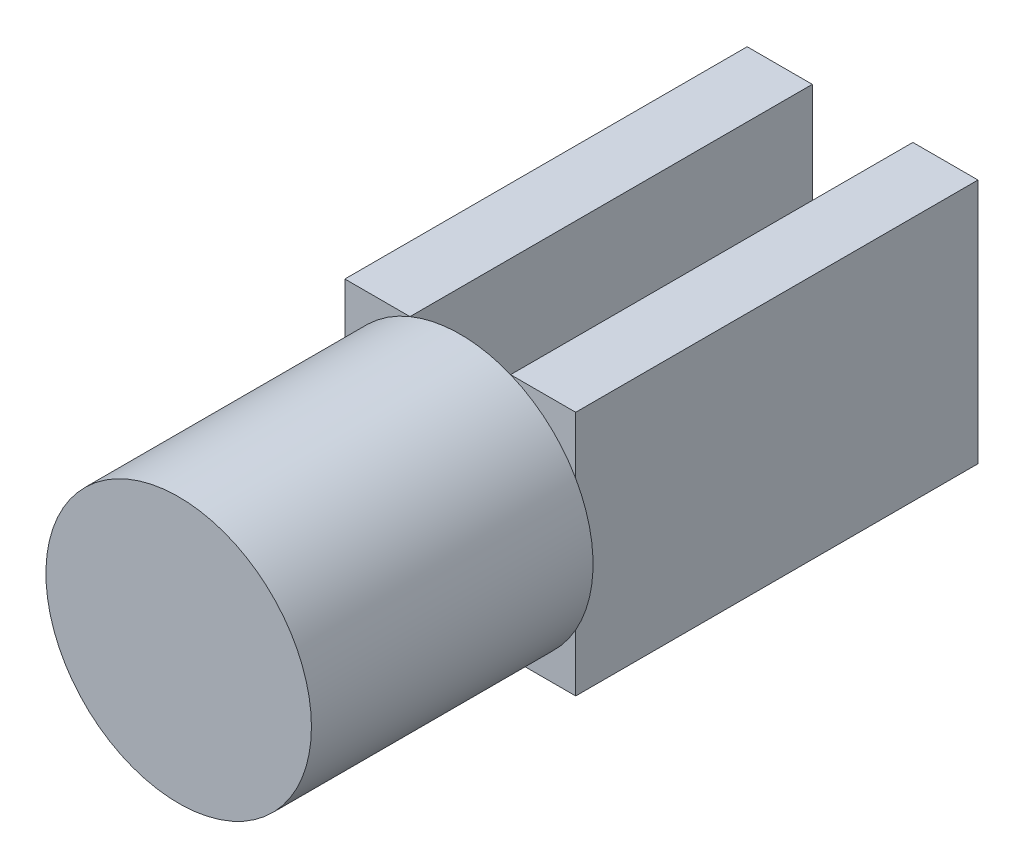
ISO-10303-21;
HEADER;
FILE_DESCRIPTION(('STEP AP214'),'2;1');
FILE_NAME('part.step','',(''),(''),'','','');
FILE_SCHEMA(('AUTOMOTIVE_DESIGN { 1 0 10303 214 1 1 1 1 }'));
ENDSEC;
DATA;
#1=APPLICATION_CONTEXT('core data for automotive mechanical design processes');
#2=APPLICATION_PROTOCOL_DEFINITION('international standard','automotive_design',2000,#1);
#3=PRODUCT_CONTEXT('',#1,'mechanical');
#4=PRODUCT('Part','Part','',(#3));
#5=PRODUCT_RELATED_PRODUCT_CATEGORY('part','',(#4));
#6=PRODUCT_DEFINITION_FORMATION('','',#4);
#7=PRODUCT_DEFINITION_CONTEXT('part definition',#1,'design');
#8=PRODUCT_DEFINITION('design','',#6,#7);
#9=PRODUCT_DEFINITION_SHAPE('','',#8);
#10=(LENGTH_UNIT() NAMED_UNIT(*) SI_UNIT(.MILLI.,.METRE.));
#11=(NAMED_UNIT(*) PLANE_ANGLE_UNIT() SI_UNIT($,.RADIAN.));
#12=(NAMED_UNIT(*) SI_UNIT($,.STERADIAN.) SOLID_ANGLE_UNIT());
#13=UNCERTAINTY_MEASURE_WITH_UNIT(LENGTH_MEASURE(1.E-05),#10,'distance_accuracy_value','');
#14=(GEOMETRIC_REPRESENTATION_CONTEXT(3) GLOBAL_UNCERTAINTY_ASSIGNED_CONTEXT((#13)) GLOBAL_UNIT_ASSIGNED_CONTEXT((#10,
#11,#12)) REPRESENTATION_CONTEXT('',''));
#15=CARTESIAN_POINT('',(0.,0.,0.));
#16=DIRECTION('',(0.,0.,1.));
#17=DIRECTION('',(1.,0.,0.));
#18=AXIS2_PLACEMENT_3D('',#15,#16,#17);
#19=CARTESIAN_POINT('',(0.,0.,0.));
#20=DIRECTION('',(0.,0.,1.));
#21=DIRECTION('',(1.,0.,0.));
#22=AXIS2_PLACEMENT_3D('',#19,#20,#21);
#23=PLANE('',#22);
#24=DIRECTION('',(0.,-1.,0.));
#25=VECTOR('',#24,1.);
#26=CARTESIAN_POINT('',(-12.5,30.5409561081509,0.));
#27=LINE('',#26,#25);
#28=CARTESIAN_POINT('',(-12.5,30.5409561081509,0.));
#29=VERTEX_POINT('',#28);
#30=CARTESIAN_POINT('',(-12.5,-30.5409561081509,0.));
#31=VERTEX_POINT('',#30);
#32=EDGE_CURVE('E134',#29,#31,#27,.T.);
#33=ORIENTED_EDGE('',*,*,#32,.F.);
#34=CARTESIAN_POINT('',(0.,0.,0.));
#35=DIRECTION('',(0.,0.,1.));
#36=DIRECTION('',(1.,0.,0.));
#37=AXIS2_PLACEMENT_3D('',#34,#35,#36);
#38=CIRCLE('',#37,33.);
#39=CARTESIAN_POINT('',(12.5,30.5409561081509,0.));
#40=VERTEX_POINT('',#39);
#41=EDGE_CURVE('E124',#40,#29,#38,.T.);
#42=ORIENTED_EDGE('',*,*,#41,.F.);
#43=DIRECTION('',(0.,-1.,0.));
#44=VECTOR('',#43,1.);
#45=CARTESIAN_POINT('',(12.5,30.5409561081509,0.));
#46=LINE('',#45,#44);
#47=CARTESIAN_POINT('',(12.5,-30.5409561081509,0.));
#48=VERTEX_POINT('',#47);
#49=EDGE_CURVE('E147',#40,#48,#46,.T.);
#50=ORIENTED_EDGE('',*,*,#49,.T.);
#51=EDGE_CURVE('E58',#31,#48,#38,.T.);
#52=ORIENTED_EDGE('',*,*,#51,.F.);
#53=EDGE_LOOP('',(#33,#42,#50,#52));
#54=FACE_BOUND('',#53,.T.);
#55=ADVANCED_FACE('F35',(#54),#23,.F.);
#56=DIRECTION('',(0.,-1.,0.));
#57=VECTOR('',#56,1.);
#58=CARTESIAN_POINT('',(28.6905653042879,30.5409561081509,0.));
#59=LINE('',#58,#57);
#60=CARTESIAN_POINT('',(28.6905653042879,16.3049520858048,0.));
#61=VERTEX_POINT('',#60);
#62=CARTESIAN_POINT('',(28.6905653042879,-16.3049520858048,0.));
#63=VERTEX_POINT('',#62);
#64=EDGE_CURVE('E43',#61,#63,#59,.T.);
#65=ORIENTED_EDGE('',*,*,#64,.F.);
#66=EDGE_CURVE('E126',#63,#61,#38,.T.);
#67=ORIENTED_EDGE('',*,*,#66,.F.);
#68=EDGE_LOOP('',(#65,#67));
#69=FACE_BOUND('',#68,.T.);
#70=ADVANCED_FACE('F240',(#69),#23,.F.);
#71=CARTESIAN_POINT('',(0.,0.,70.));
#72=DIRECTION('',(0.,0.,-1.));
#73=DIRECTION('',(-1.,0.,0.));
#74=AXIS2_PLACEMENT_3D('',#71,#72,#73);
#75=CYLINDRICAL_SURFACE('',#74,33.);
#76=CARTESIAN_POINT('',(0.,0.,70.));
#77=DIRECTION('',(0.,0.,1.));
#78=DIRECTION('',(1.,0.,0.));
#79=AXIS2_PLACEMENT_3D('',#76,#77,#78);
#80=CIRCLE('',#79,33.);
#81=CARTESIAN_POINT('',(33.,0.,70.));
#82=VERTEX_POINT('',#81);
#83=EDGE_CURVE('E155',#82,#82,#80,.T.);
#84=ORIENTED_EDGE('',*,*,#83,.F.);
#85=EDGE_LOOP('',(#84));
#86=FACE_BOUND('',#85,.T.);
#87=EDGE_CURVE('E152',#61,#40,#38,.T.);
#88=ORIENTED_EDGE('',*,*,#87,.T.);
#89=ORIENTED_EDGE('',*,*,#41,.T.);
#90=CARTESIAN_POINT('',(-28.6905653042879,16.3049520858048,0.));
#91=VERTEX_POINT('',#90);
#92=EDGE_CURVE('E114',#29,#91,#38,.T.);
#93=ORIENTED_EDGE('',*,*,#92,.T.);
#94=CARTESIAN_POINT('',(-28.6905653042879,-16.3049520858048,0.));
#95=VERTEX_POINT('',#94);
#96=EDGE_CURVE('E125',#91,#95,#38,.T.);
#97=ORIENTED_EDGE('',*,*,#96,.T.);
#98=EDGE_CURVE('E159',#95,#31,#38,.T.);
#99=ORIENTED_EDGE('',*,*,#98,.T.);
#100=ORIENTED_EDGE('',*,*,#51,.T.);
#101=EDGE_CURVE('E154',#48,#63,#38,.T.);
#102=ORIENTED_EDGE('',*,*,#101,.T.);
#103=ORIENTED_EDGE('',*,*,#66,.T.);
#104=EDGE_LOOP('',(#88,#89,#93,#97,#99,#100,#102,#103));
#105=FACE_BOUND('',#104,.T.);
#106=ADVANCED_FACE('F37',(#86,#105),#75,.T.);
#107=CARTESIAN_POINT('',(0.,0.,70.));
#108=DIRECTION('',(0.,0.,1.));
#109=DIRECTION('',(1.,0.,0.));
#110=AXIS2_PLACEMENT_3D('',#107,#108,#109);
#111=PLANE('',#110);
#112=ORIENTED_EDGE('',*,*,#83,.T.);
#113=EDGE_LOOP('',(#112));
#114=FACE_BOUND('',#113,.T.);
#115=ADVANCED_FACE('F248',(#114),#111,.T.);
#116=ORIENTED_EDGE('',*,*,#96,.F.);
#117=DIRECTION('',(0.,-1.,0.));
#118=VECTOR('',#117,1.);
#119=CARTESIAN_POINT('',(-28.6905653042879,0.,0.));
#120=LINE('',#119,#118);
#121=EDGE_CURVE('E11',#91,#95,#120,.T.);
#122=ORIENTED_EDGE('',*,*,#121,.T.);
#123=EDGE_LOOP('',(#116,#122));
#124=FACE_BOUND('',#123,.T.);
#125=ADVANCED_FACE('F227',(#124),#23,.F.);
#126=CARTESIAN_POINT('',(0.,0.,0.));
#127=DIRECTION('',(0.,0.,1.));
#128=DIRECTION('',(1.,0.,0.));
#129=AXIS2_PLACEMENT_3D('',#126,#127,#128);
#130=PLANE('',#129);
#131=ORIENTED_EDGE('',*,*,#87,.F.);
#132=CARTESIAN_POINT('',(28.6905653042879,30.5409561081509,0.));
#133=VERTEX_POINT('',#132);
#134=EDGE_CURVE('E182',#133,#61,#59,.T.);
#135=ORIENTED_EDGE('',*,*,#134,.F.);
#136=DIRECTION('',(1.,0.,0.));
#137=VECTOR('',#136,1.);
#138=CARTESIAN_POINT('',(12.5,30.5409561081509,0.));
#139=LINE('',#138,#137);
#140=EDGE_CURVE('E170',#40,#133,#139,.T.);
#141=ORIENTED_EDGE('',*,*,#140,.F.);
#142=EDGE_LOOP('',(#131,#135,#141));
#143=FACE_BOUND('',#142,.T.);
#144=ADVANCED_FACE('F247',(#143),#130,.T.);
#145=ORIENTED_EDGE('',*,*,#101,.F.);
#146=DIRECTION('',(1.,0.,0.));
#147=VECTOR('',#146,1.);
#148=CARTESIAN_POINT('',(12.5,-30.5409561081509,0.));
#149=LINE('',#148,#147);
#150=CARTESIAN_POINT('',(28.6905653042879,-30.5409561081509,0.));
#151=VERTEX_POINT('',#150);
#152=EDGE_CURVE('E187',#48,#151,#149,.T.);
#153=ORIENTED_EDGE('',*,*,#152,.T.);
#154=EDGE_CURVE('E183',#63,#151,#59,.T.);
#155=ORIENTED_EDGE('',*,*,#154,.F.);
#156=EDGE_LOOP('',(#145,#153,#155));
#157=FACE_BOUND('',#156,.T.);
#158=ADVANCED_FACE('F253',(#157),#130,.T.);
#159=CARTESIAN_POINT('',(12.5,30.5409561081509,-100.));
#160=DIRECTION('',(-1.,0.,0.));
#161=DIRECTION('',(0.,0.,1.));
#162=AXIS2_PLACEMENT_3D('',#159,#160,#161);
#163=PLANE('',#162);
#164=ORIENTED_EDGE('',*,*,#49,.F.);
#165=DIRECTION('',(0.,0.,1.));
#166=VECTOR('',#165,1.);
#167=CARTESIAN_POINT('',(12.5,30.5409561081509,-100.));
#168=LINE('',#167,#166);
#169=CARTESIAN_POINT('',(12.5,30.5409561081509,-100.));
#170=VERTEX_POINT('',#169);
#171=EDGE_CURVE('E160',#170,#40,#168,.T.);
#172=ORIENTED_EDGE('',*,*,#171,.F.);
#173=DIRECTION('',(0.,-1.,0.));
#174=VECTOR('',#173,1.);
#175=CARTESIAN_POINT('',(12.5,30.5409561081509,-100.));
#176=LINE('',#175,#174);
#177=CARTESIAN_POINT('',(12.5,-30.5409561081509,-100.));
#178=VERTEX_POINT('',#177);
#179=EDGE_CURVE('E201',#170,#178,#176,.T.);
#180=ORIENTED_EDGE('',*,*,#179,.T.);
#181=DIRECTION('',(0.,0.,1.));
#182=VECTOR('',#181,1.);
#183=CARTESIAN_POINT('',(12.5,-30.5409561081509,-100.));
#184=LINE('',#183,#182);
#185=EDGE_CURVE('E175',#178,#48,#184,.T.);
#186=ORIENTED_EDGE('',*,*,#185,.T.);
#187=EDGE_LOOP('',(#164,#172,#180,#186));
#188=FACE_BOUND('',#187,.T.);
#189=ADVANCED_FACE('F261',(#188),#163,.T.);
#190=CARTESIAN_POINT('',(12.5,30.5409561081509,-100.));
#191=DIRECTION('',(0.,-1.,0.));
#192=DIRECTION('',(0.,0.,-1.));
#193=AXIS2_PLACEMENT_3D('',#190,#191,#192);
#194=PLANE('',#193);
#195=ORIENTED_EDGE('',*,*,#140,.T.);
#196=DIRECTION('',(0.,0.,1.));
#197=VECTOR('',#196,1.);
#198=CARTESIAN_POINT('',(28.6905653042879,30.5409561081509,-100.));
#199=LINE('',#198,#197);
#200=CARTESIAN_POINT('',(28.6905653042879,30.5409561081509,-100.));
#201=VERTEX_POINT('',#200);
#202=EDGE_CURVE('E161',#201,#133,#199,.T.);
#203=ORIENTED_EDGE('',*,*,#202,.F.);
#204=DIRECTION('',(1.,0.,0.));
#205=VECTOR('',#204,1.);
#206=CARTESIAN_POINT('',(12.5,30.5409561081509,-100.));
#207=LINE('',#206,#205);
#208=EDGE_CURVE('E177',#170,#201,#207,.T.);
#209=ORIENTED_EDGE('',*,*,#208,.F.);
#210=ORIENTED_EDGE('',*,*,#171,.T.);
#211=EDGE_LOOP('',(#195,#203,#209,#210));
#212=FACE_BOUND('',#211,.T.);
#213=ADVANCED_FACE('F264',(#212),#194,.F.);
#214=CARTESIAN_POINT('',(28.6905653042879,30.5409561081509,-100.));
#215=DIRECTION('',(-1.,0.,0.));
#216=DIRECTION('',(0.,0.,1.));
#217=AXIS2_PLACEMENT_3D('',#214,#215,#216);
#218=PLANE('',#217);
#219=ORIENTED_EDGE('',*,*,#134,.T.);
#220=ORIENTED_EDGE('',*,*,#64,.T.);
#221=ORIENTED_EDGE('',*,*,#154,.T.);
#222=DIRECTION('',(0.,0.,1.));
#223=VECTOR('',#222,1.);
#224=CARTESIAN_POINT('',(28.6905653042879,-30.5409561081509,-100.));
#225=LINE('',#224,#223);
#226=CARTESIAN_POINT('',(28.6905653042879,-30.5409561081509,-100.));
#227=VERTEX_POINT('',#226);
#228=EDGE_CURVE('E167',#227,#151,#225,.T.);
#229=ORIENTED_EDGE('',*,*,#228,.F.);
#230=DIRECTION('',(0.,-1.,0.));
#231=VECTOR('',#230,1.);
#232=CARTESIAN_POINT('',(28.6905653042879,30.5409561081509,-100.));
#233=LINE('',#232,#231);
#234=EDGE_CURVE('E196',#201,#227,#233,.T.);
#235=ORIENTED_EDGE('',*,*,#234,.F.);
#236=ORIENTED_EDGE('',*,*,#202,.T.);
#237=EDGE_LOOP('',(#219,#220,#221,#229,#235,#236));
#238=FACE_BOUND('',#237,.T.);
#239=ADVANCED_FACE('F269',(#238),#218,.F.);
#240=CARTESIAN_POINT('',(12.5,-30.5409561081509,-100.));
#241=DIRECTION('',(0.,-1.,0.));
#242=DIRECTION('',(0.,0.,-1.));
#243=AXIS2_PLACEMENT_3D('',#240,#241,#242);
#244=PLANE('',#243);
#245=ORIENTED_EDGE('',*,*,#152,.F.);
#246=ORIENTED_EDGE('',*,*,#185,.F.);
#247=DIRECTION('',(1.,0.,0.));
#248=VECTOR('',#247,1.);
#249=CARTESIAN_POINT('',(12.5,-30.5409561081509,-100.));
#250=LINE('',#249,#248);
#251=EDGE_CURVE('E198',#178,#227,#250,.T.);
#252=ORIENTED_EDGE('',*,*,#251,.T.);
#253=ORIENTED_EDGE('',*,*,#228,.T.);
#254=EDGE_LOOP('',(#245,#246,#252,#253));
#255=FACE_BOUND('',#254,.T.);
#256=ADVANCED_FACE('F266',(#255),#244,.T.);
#257=CARTESIAN_POINT('',(0.,0.,-100.));
#258=DIRECTION('',(0.,0.,1.));
#259=DIRECTION('',(1.,0.,0.));
#260=AXIS2_PLACEMENT_3D('',#257,#258,#259);
#261=PLANE('',#260);
#262=ORIENTED_EDGE('',*,*,#179,.F.);
#263=ORIENTED_EDGE('',*,*,#208,.T.);
#264=ORIENTED_EDGE('',*,*,#234,.T.);
#265=ORIENTED_EDGE('',*,*,#251,.F.);
#266=EDGE_LOOP('',(#262,#263,#264,#265));
#267=FACE_BOUND('',#266,.T.);
#268=ADVANCED_FACE('F238',(#267),#261,.F.);
#269=CARTESIAN_POINT('',(0.,0.,0.));
#270=DIRECTION('',(0.,0.,-1.));
#271=DIRECTION('',(-1.,0.,0.));
#272=AXIS2_PLACEMENT_3D('',#269,#270,#271);
#273=PLANE('',#272);
#274=DIRECTION('',(0.,-1.,0.));
#275=VECTOR('',#274,1.);
#276=CARTESIAN_POINT('',(-28.6905653042879,30.5409561081509,0.));
#277=LINE('',#276,#275);
#278=CARTESIAN_POINT('',(-28.6905653042879,30.5409561081509,0.));
#279=VERTEX_POINT('',#278);
#280=EDGE_CURVE('E120',#279,#91,#277,.T.);
#281=ORIENTED_EDGE('',*,*,#280,.T.);
#282=ORIENTED_EDGE('',*,*,#92,.F.);
#283=DIRECTION('',(-1.,0.,0.));
#284=VECTOR('',#283,1.);
#285=CARTESIAN_POINT('',(-12.5,30.5409561081509,0.));
#286=LINE('',#285,#284);
#287=EDGE_CURVE('E118',#29,#279,#286,.T.);
#288=ORIENTED_EDGE('',*,*,#287,.T.);
#289=EDGE_LOOP('',(#281,#282,#288));
#290=FACE_BOUND('',#289,.T.);
#291=ADVANCED_FACE('F116',(#290),#273,.F.);
#292=CARTESIAN_POINT('',(-12.5,30.5409561081509,-100.));
#293=DIRECTION('',(-1.,0.,0.));
#294=DIRECTION('',(0.,0.,1.));
#295=AXIS2_PLACEMENT_3D('',#292,#293,#294);
#296=PLANE('',#295);
#297=ORIENTED_EDGE('',*,*,#32,.T.);
#298=DIRECTION('',(0.,0.,1.));
#299=VECTOR('',#298,1.);
#300=CARTESIAN_POINT('',(-12.5,-30.5409561081509,-100.));
#301=LINE('',#300,#299);
#302=CARTESIAN_POINT('',(-12.5,-30.5409561081509,-100.));
#303=VERTEX_POINT('',#302);
#304=EDGE_CURVE('E217',#303,#31,#301,.T.);
#305=ORIENTED_EDGE('',*,*,#304,.F.);
#306=DIRECTION('',(0.,-1.,0.));
#307=VECTOR('',#306,1.);
#308=CARTESIAN_POINT('',(-12.5,30.5409561081509,-100.));
#309=LINE('',#308,#307);
#310=CARTESIAN_POINT('',(-12.5,30.5409561081509,-100.));
#311=VERTEX_POINT('',#310);
#312=EDGE_CURVE('E136',#311,#303,#309,.T.);
#313=ORIENTED_EDGE('',*,*,#312,.F.);
#314=DIRECTION('',(0.,0.,1.));
#315=VECTOR('',#314,1.);
#316=CARTESIAN_POINT('',(-12.5,30.5409561081509,-100.));
#317=LINE('',#316,#315);
#318=EDGE_CURVE('E130',#311,#29,#317,.T.);
#319=ORIENTED_EDGE('',*,*,#318,.T.);
#320=EDGE_LOOP('',(#297,#305,#313,#319));
#321=FACE_BOUND('',#320,.T.);
#322=ADVANCED_FACE('F131',(#321),#296,.F.);
#323=CARTESIAN_POINT('',(-12.5,-30.5409561081509,-100.));
#324=DIRECTION('',(0.,1.,0.));
#325=DIRECTION('',(0.,0.,1.));
#326=AXIS2_PLACEMENT_3D('',#323,#324,#325);
#327=PLANE('',#326);
#328=DIRECTION('',(-1.,0.,0.));
#329=VECTOR('',#328,1.);
#330=CARTESIAN_POINT('',(-12.5,-30.5409561081509,0.));
#331=LINE('',#330,#329);
#332=CARTESIAN_POINT('',(-28.6905653042879,-30.5409561081509,0.));
#333=VERTEX_POINT('',#332);
#334=EDGE_CURVE('E148',#31,#333,#331,.T.);
#335=ORIENTED_EDGE('',*,*,#334,.T.);
#336=DIRECTION('',(0.,0.,1.));
#337=VECTOR('',#336,1.);
#338=CARTESIAN_POINT('',(-28.6905653042879,-30.5409561081509,-100.));
#339=LINE('',#338,#337);
#340=CARTESIAN_POINT('',(-28.6905653042879,-30.5409561081509,-100.));
#341=VERTEX_POINT('',#340);
#342=EDGE_CURVE('E215',#341,#333,#339,.T.);
#343=ORIENTED_EDGE('',*,*,#342,.F.);
#344=DIRECTION('',(-1.,0.,0.));
#345=VECTOR('',#344,1.);
#346=CARTESIAN_POINT('',(-12.5,-30.5409561081509,-100.));
#347=LINE('',#346,#345);
#348=EDGE_CURVE('E205',#303,#341,#347,.T.);
#349=ORIENTED_EDGE('',*,*,#348,.F.);
#350=ORIENTED_EDGE('',*,*,#304,.T.);
#351=EDGE_LOOP('',(#335,#343,#349,#350));
#352=FACE_BOUND('',#351,.T.);
#353=ADVANCED_FACE('F220',(#352),#327,.F.);
#354=CARTESIAN_POINT('',(-28.6905653042879,30.5409561081509,-100.));
#355=DIRECTION('',(-1.,0.,0.));
#356=DIRECTION('',(0.,0.,1.));
#357=AXIS2_PLACEMENT_3D('',#354,#355,#356);
#358=PLANE('',#357);
#359=ORIENTED_EDGE('',*,*,#280,.F.);
#360=DIRECTION('',(0.,0.,1.));
#361=VECTOR('',#360,1.);
#362=CARTESIAN_POINT('',(-28.6905653042879,30.5409561081509,-100.));
#363=LINE('',#362,#361);
#364=CARTESIAN_POINT('',(-28.6905653042879,30.5409561081509,-100.));
#365=VERTEX_POINT('',#364);
#366=EDGE_CURVE('E141',#365,#279,#363,.T.);
#367=ORIENTED_EDGE('',*,*,#366,.F.);
#368=DIRECTION('',(0.,-1.,0.));
#369=VECTOR('',#368,1.);
#370=CARTESIAN_POINT('',(-28.6905653042879,30.5409561081509,-100.));
#371=LINE('',#370,#369);
#372=EDGE_CURVE('E207',#365,#341,#371,.T.);
#373=ORIENTED_EDGE('',*,*,#372,.T.);
#374=ORIENTED_EDGE('',*,*,#342,.T.);
#375=EDGE_CURVE('E50',#95,#333,#277,.T.);
#376=ORIENTED_EDGE('',*,*,#375,.F.);
#377=ORIENTED_EDGE('',*,*,#121,.F.);
#378=EDGE_LOOP('',(#359,#367,#373,#374,#376,#377));
#379=FACE_BOUND('',#378,.T.);
#380=ADVANCED_FACE('F225',(#379),#358,.T.);
#381=CARTESIAN_POINT('',(-12.5,30.5409561081509,-100.));
#382=DIRECTION('',(0.,1.,0.));
#383=DIRECTION('',(0.,0.,1.));
#384=AXIS2_PLACEMENT_3D('',#381,#382,#383);
#385=PLANE('',#384);
#386=ORIENTED_EDGE('',*,*,#287,.F.);
#387=ORIENTED_EDGE('',*,*,#318,.F.);
#388=DIRECTION('',(-1.,0.,0.));
#389=VECTOR('',#388,1.);
#390=CARTESIAN_POINT('',(-12.5,30.5409561081509,-100.));
#391=LINE('',#390,#389);
#392=EDGE_CURVE('E140',#311,#365,#391,.T.);
#393=ORIENTED_EDGE('',*,*,#392,.T.);
#394=ORIENTED_EDGE('',*,*,#366,.T.);
#395=EDGE_LOOP('',(#386,#387,#393,#394));
#396=FACE_BOUND('',#395,.T.);
#397=ADVANCED_FACE('F143',(#396),#385,.T.);
#398=CARTESIAN_POINT('',(0.,0.,-100.));
#399=DIRECTION('',(0.,0.,-1.));
#400=DIRECTION('',(-1.,0.,0.));
#401=AXIS2_PLACEMENT_3D('',#398,#399,#400);
#402=PLANE('',#401);
#403=ORIENTED_EDGE('',*,*,#312,.T.);
#404=ORIENTED_EDGE('',*,*,#348,.T.);
#405=ORIENTED_EDGE('',*,*,#372,.F.);
#406=ORIENTED_EDGE('',*,*,#392,.F.);
#407=EDGE_LOOP('',(#403,#404,#405,#406));
#408=FACE_BOUND('',#407,.T.);
#409=ADVANCED_FACE('F224',(#408),#402,.T.);
#410=ORIENTED_EDGE('',*,*,#334,.F.);
#411=ORIENTED_EDGE('',*,*,#98,.F.);
#412=ORIENTED_EDGE('',*,*,#375,.T.);
#413=EDGE_LOOP('',(#410,#411,#412));
#414=FACE_BOUND('',#413,.T.);
#415=ADVANCED_FACE('F229',(#414),#273,.F.);
#416=CLOSED_SHELL('',(#55,#70,#106,#115,#125,#144,#158,#189,#213,#239,#256,#268,#291,#322,#353,
#380,#397,#409,#415));
#417=MANIFOLD_SOLID_BREP('B2',#416);
#418=ADVANCED_BREP_SHAPE_REPRESENTATION('',(#18,#417),#14);
#419=SHAPE_DEFINITION_REPRESENTATION(#9,#418);
ENDSEC;
END-ISO-10303-21;
